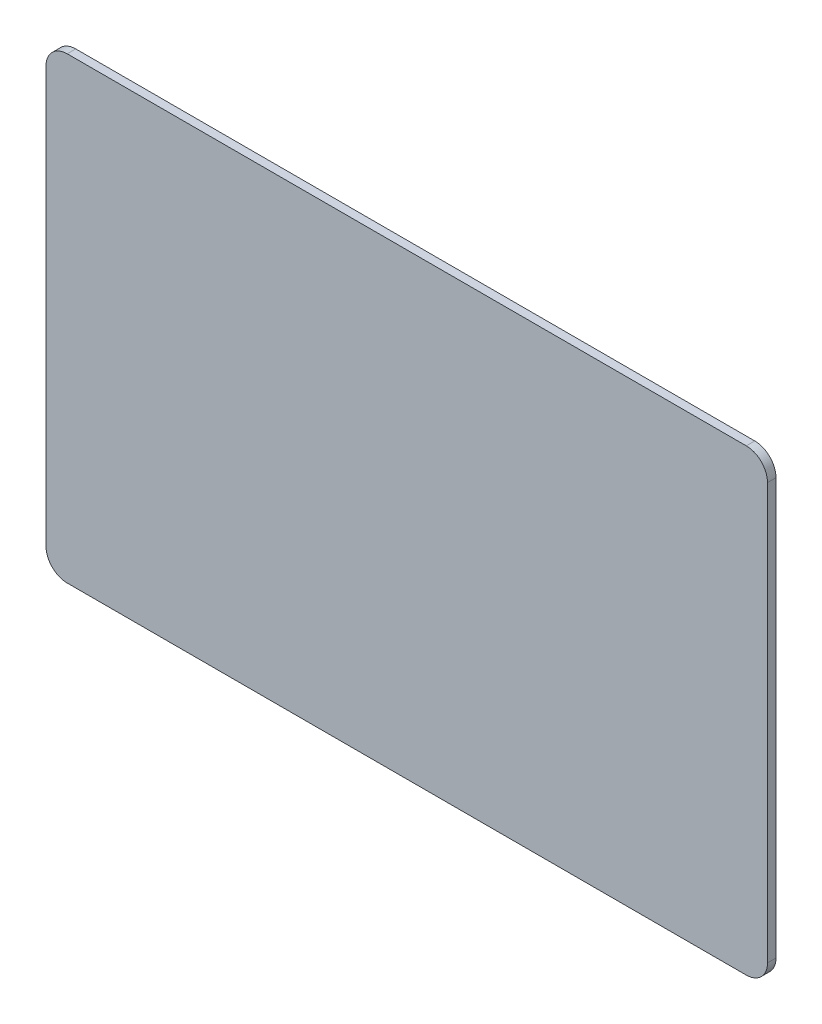
ISO-10303-21;
HEADER;
FILE_DESCRIPTION(('STEP AP214'),'2;1');
FILE_NAME('part.step','',(''),(''),'','','');
FILE_SCHEMA(('AUTOMOTIVE_DESIGN { 1 0 10303 214 1 1 1 1 }'));
ENDSEC;
DATA;
#1=APPLICATION_CONTEXT('core data for automotive mechanical design processes');
#2=APPLICATION_PROTOCOL_DEFINITION('international standard','automotive_design',2000,#1);
#3=PRODUCT_CONTEXT('',#1,'mechanical');
#4=PRODUCT('Part','Part','',(#3));
#5=PRODUCT_RELATED_PRODUCT_CATEGORY('part','',(#4));
#6=PRODUCT_DEFINITION_FORMATION('','',#4);
#7=PRODUCT_DEFINITION_CONTEXT('part definition',#1,'design');
#8=PRODUCT_DEFINITION('design','',#6,#7);
#9=PRODUCT_DEFINITION_SHAPE('','',#8);
#10=(LENGTH_UNIT() NAMED_UNIT(*) SI_UNIT(.MILLI.,.METRE.));
#11=(NAMED_UNIT(*) PLANE_ANGLE_UNIT() SI_UNIT($,.RADIAN.));
#12=(NAMED_UNIT(*) SI_UNIT($,.STERADIAN.) SOLID_ANGLE_UNIT());
#13=UNCERTAINTY_MEASURE_WITH_UNIT(LENGTH_MEASURE(1.E-05),#10,'distance_accuracy_value','');
#14=(GEOMETRIC_REPRESENTATION_CONTEXT(3) GLOBAL_UNCERTAINTY_ASSIGNED_CONTEXT((#13)) GLOBAL_UNIT_ASSIGNED_CONTEXT((#10,
#11,#12)) REPRESENTATION_CONTEXT('',''));
#15=CARTESIAN_POINT('',(0.,0.,0.));
#16=DIRECTION('',(0.,0.,1.));
#17=DIRECTION('',(1.,0.,0.));
#18=AXIS2_PLACEMENT_3D('',#15,#16,#17);
#19=CARTESIAN_POINT('',(2.5,2.5,1.));
#20=DIRECTION('',(0.,0.,-1.));
#21=DIRECTION('',(-1.,0.,0.));
#22=AXIS2_PLACEMENT_3D('',#19,#20,#21);
#23=CYLINDRICAL_SURFACE('',#22,2.5);
#24=CARTESIAN_POINT('',(2.5,2.5,0.));
#25=DIRECTION('',(0.,0.,1.));
#26=DIRECTION('',(-1.,0.,0.));
#27=AXIS2_PLACEMENT_3D('',#24,#25,#26);
#28=CIRCLE('',#27,2.5);
#29=CARTESIAN_POINT('',(0.,2.50000000000002,0.));
#30=VERTEX_POINT('',#29);
#31=CARTESIAN_POINT('',(2.50000000000002,0.,0.));
#32=VERTEX_POINT('',#31);
#33=EDGE_CURVE('E135',#30,#32,#28,.T.);
#34=ORIENTED_EDGE('',*,*,#33,.T.);
#35=DIRECTION('',(0.,0.,-1.));
#36=VECTOR('',#35,1.);
#37=CARTESIAN_POINT('',(2.50000000000002,0.,1.));
#38=LINE('',#37,#36);
#39=CARTESIAN_POINT('',(2.50000000000002,0.,1.));
#40=VERTEX_POINT('',#39);
#41=EDGE_CURVE('E11',#40,#32,#38,.T.);
#42=ORIENTED_EDGE('',*,*,#41,.F.);
#43=CARTESIAN_POINT('',(2.5,2.5,1.));
#44=DIRECTION('',(0.,0.,1.));
#45=DIRECTION('',(-1.,0.,0.));
#46=AXIS2_PLACEMENT_3D('',#43,#44,#45);
#47=CIRCLE('',#46,2.5);
#48=CARTESIAN_POINT('',(0.,2.50000000000002,1.));
#49=VERTEX_POINT('',#48);
#50=EDGE_CURVE('E149',#49,#40,#47,.T.);
#51=ORIENTED_EDGE('',*,*,#50,.F.);
#52=DIRECTION('',(0.,0.,-1.));
#53=VECTOR('',#52,1.);
#54=CARTESIAN_POINT('',(0.,2.50000000000002,1.));
#55=LINE('',#54,#53);
#56=EDGE_CURVE('E131',#49,#30,#55,.T.);
#57=ORIENTED_EDGE('',*,*,#56,.T.);
#58=EDGE_LOOP('',(#34,#42,#51,#57));
#59=FACE_BOUND('',#58,.T.);
#60=ADVANCED_FACE('F39',(#59),#23,.T.);
#61=CARTESIAN_POINT('',(2.50000000000002,0.,1.));
#62=DIRECTION('',(0.,1.,0.));
#63=DIRECTION('',(0.,0.,1.));
#64=AXIS2_PLACEMENT_3D('',#61,#62,#63);
#65=PLANE('',#64);
#66=DIRECTION('',(1.,0.,0.));
#67=VECTOR('',#66,1.);
#68=CARTESIAN_POINT('',(2.50000000000002,0.,0.));
#69=LINE('',#68,#67);
#70=CARTESIAN_POINT('',(82.5,0.,0.));
#71=VERTEX_POINT('',#70);
#72=EDGE_CURVE('E138',#32,#71,#69,.T.);
#73=ORIENTED_EDGE('',*,*,#72,.T.);
#74=DIRECTION('',(0.,0.,-1.));
#75=VECTOR('',#74,1.);
#76=CARTESIAN_POINT('',(82.5,0.,1.));
#77=LINE('',#76,#75);
#78=CARTESIAN_POINT('',(82.5,0.,1.));
#79=VERTEX_POINT('',#78);
#80=EDGE_CURVE('E47',#79,#71,#77,.T.);
#81=ORIENTED_EDGE('',*,*,#80,.F.);
#82=DIRECTION('',(1.,0.,0.));
#83=VECTOR('',#82,1.);
#84=CARTESIAN_POINT('',(2.50000000000002,0.,1.));
#85=LINE('',#84,#83);
#86=EDGE_CURVE('E98',#40,#79,#85,.T.);
#87=ORIENTED_EDGE('',*,*,#86,.F.);
#88=ORIENTED_EDGE('',*,*,#41,.T.);
#89=EDGE_LOOP('',(#73,#81,#87,#88));
#90=FACE_BOUND('',#89,.T.);
#91=ADVANCED_FACE('F184',(#90),#65,.F.);
#92=CARTESIAN_POINT('',(82.5,2.5,1.));
#93=DIRECTION('',(0.,0.,-1.));
#94=DIRECTION('',(-1.,0.,0.));
#95=AXIS2_PLACEMENT_3D('',#92,#93,#94);
#96=CYLINDRICAL_SURFACE('',#95,2.5);
#97=CARTESIAN_POINT('',(82.5,2.5,0.));
#98=DIRECTION('',(0.,0.,1.));
#99=DIRECTION('',(1.,0.,0.));
#100=AXIS2_PLACEMENT_3D('',#97,#98,#99);
#101=CIRCLE('',#100,2.5);
#102=CARTESIAN_POINT('',(85.,2.5,0.));
#103=VERTEX_POINT('',#102);
#104=EDGE_CURVE('E140',#71,#103,#101,.T.);
#105=ORIENTED_EDGE('',*,*,#104,.T.);
#106=DIRECTION('',(0.,0.,-1.));
#107=VECTOR('',#106,1.);
#108=CARTESIAN_POINT('',(85.,2.5,1.));
#109=LINE('',#108,#107);
#110=CARTESIAN_POINT('',(85.,2.5,1.));
#111=VERTEX_POINT('',#110);
#112=EDGE_CURVE('E156',#111,#103,#109,.T.);
#113=ORIENTED_EDGE('',*,*,#112,.F.);
#114=CARTESIAN_POINT('',(82.5,2.5,1.));
#115=DIRECTION('',(0.,0.,1.));
#116=DIRECTION('',(1.,0.,0.));
#117=AXIS2_PLACEMENT_3D('',#114,#115,#116);
#118=CIRCLE('',#117,2.5);
#119=EDGE_CURVE('E164',#79,#111,#118,.T.);
#120=ORIENTED_EDGE('',*,*,#119,.F.);
#121=ORIENTED_EDGE('',*,*,#80,.T.);
#122=EDGE_LOOP('',(#105,#113,#120,#121));
#123=FACE_BOUND('',#122,.T.);
#124=ADVANCED_FACE('F162',(#123),#96,.T.);
#125=CARTESIAN_POINT('',(85.,2.50000000000002,1.));
#126=DIRECTION('',(-1.,0.,0.));
#127=DIRECTION('',(0.,0.,1.));
#128=AXIS2_PLACEMENT_3D('',#125,#126,#127);
#129=PLANE('',#128);
#130=DIRECTION('',(0.,1.,0.));
#131=VECTOR('',#130,1.);
#132=CARTESIAN_POINT('',(85.,2.50000000000002,0.));
#133=LINE('',#132,#131);
#134=CARTESIAN_POINT('',(85.,51.5,0.));
#135=VERTEX_POINT('',#134);
#136=EDGE_CURVE('E142',#103,#135,#133,.T.);
#137=ORIENTED_EDGE('',*,*,#136,.T.);
#138=DIRECTION('',(0.,0.,-1.));
#139=VECTOR('',#138,1.);
#140=CARTESIAN_POINT('',(85.,51.5,1.));
#141=LINE('',#140,#139);
#142=CARTESIAN_POINT('',(85.,51.5,1.));
#143=VERTEX_POINT('',#142);
#144=EDGE_CURVE('E153',#143,#135,#141,.T.);
#145=ORIENTED_EDGE('',*,*,#144,.F.);
#146=DIRECTION('',(0.,1.,0.));
#147=VECTOR('',#146,1.);
#148=CARTESIAN_POINT('',(85.,2.50000000000002,1.));
#149=LINE('',#148,#147);
#150=EDGE_CURVE('E176',#111,#143,#149,.T.);
#151=ORIENTED_EDGE('',*,*,#150,.F.);
#152=ORIENTED_EDGE('',*,*,#112,.T.);
#153=EDGE_LOOP('',(#137,#145,#151,#152));
#154=FACE_BOUND('',#153,.T.);
#155=ADVANCED_FACE('F172',(#154),#129,.F.);
#156=CARTESIAN_POINT('',(82.5,51.5,1.));
#157=DIRECTION('',(0.,0.,-1.));
#158=DIRECTION('',(-1.,0.,0.));
#159=AXIS2_PLACEMENT_3D('',#156,#157,#158);
#160=CYLINDRICAL_SURFACE('',#159,2.5);
#161=CARTESIAN_POINT('',(82.5,51.5,0.));
#162=DIRECTION('',(0.,0.,1.));
#163=DIRECTION('',(-1.,0.,0.));
#164=AXIS2_PLACEMENT_3D('',#161,#162,#163);
#165=CIRCLE('',#164,2.5);
#166=CARTESIAN_POINT('',(82.5,54.,0.));
#167=VERTEX_POINT('',#166);
#168=EDGE_CURVE('E144',#135,#167,#165,.T.);
#169=ORIENTED_EDGE('',*,*,#168,.T.);
#170=DIRECTION('',(0.,0.,-1.));
#171=VECTOR('',#170,1.);
#172=CARTESIAN_POINT('',(82.5,54.,1.));
#173=LINE('',#172,#171);
#174=CARTESIAN_POINT('',(82.5,54.,1.));
#175=VERTEX_POINT('',#174);
#176=EDGE_CURVE('E126',#175,#167,#173,.T.);
#177=ORIENTED_EDGE('',*,*,#176,.F.);
#178=CARTESIAN_POINT('',(82.5,51.5,1.));
#179=DIRECTION('',(0.,0.,1.));
#180=DIRECTION('',(-1.,0.,0.));
#181=AXIS2_PLACEMENT_3D('',#178,#179,#180);
#182=CIRCLE('',#181,2.5);
#183=EDGE_CURVE('E117',#143,#175,#182,.T.);
#184=ORIENTED_EDGE('',*,*,#183,.F.);
#185=ORIENTED_EDGE('',*,*,#144,.T.);
#186=EDGE_LOOP('',(#169,#177,#184,#185));
#187=FACE_BOUND('',#186,.T.);
#188=ADVANCED_FACE('F175',(#187),#160,.T.);
#189=CARTESIAN_POINT('',(2.50000000000002,54.,1.));
#190=DIRECTION('',(0.,-1.,0.));
#191=DIRECTION('',(0.,0.,-1.));
#192=AXIS2_PLACEMENT_3D('',#189,#190,#191);
#193=PLANE('',#192);
#194=DIRECTION('',(-1.,0.,0.));
#195=VECTOR('',#194,1.);
#196=CARTESIAN_POINT('',(2.50000000000002,54.,0.));
#197=LINE('',#196,#195);
#198=CARTESIAN_POINT('',(2.50000000000002,54.,0.));
#199=VERTEX_POINT('',#198);
#200=EDGE_CURVE('E125',#167,#199,#197,.T.);
#201=ORIENTED_EDGE('',*,*,#200,.T.);
#202=DIRECTION('',(0.,0.,-1.));
#203=VECTOR('',#202,1.);
#204=CARTESIAN_POINT('',(2.50000000000002,54.,1.));
#205=LINE('',#204,#203);
#206=CARTESIAN_POINT('',(2.50000000000002,54.,1.));
#207=VERTEX_POINT('',#206);
#208=EDGE_CURVE('E122',#207,#199,#205,.T.);
#209=ORIENTED_EDGE('',*,*,#208,.F.);
#210=DIRECTION('',(-1.,0.,0.));
#211=VECTOR('',#210,1.);
#212=CARTESIAN_POINT('',(2.50000000000002,54.,1.));
#213=LINE('',#212,#211);
#214=EDGE_CURVE('E111',#175,#207,#213,.T.);
#215=ORIENTED_EDGE('',*,*,#214,.F.);
#216=ORIENTED_EDGE('',*,*,#176,.T.);
#217=EDGE_LOOP('',(#201,#209,#215,#216));
#218=FACE_BOUND('',#217,.T.);
#219=ADVANCED_FACE('F123',(#218),#193,.F.);
#220=CARTESIAN_POINT('',(2.5,51.5,1.));
#221=DIRECTION('',(0.,0.,-1.));
#222=DIRECTION('',(-1.,0.,0.));
#223=AXIS2_PLACEMENT_3D('',#220,#221,#222);
#224=CYLINDRICAL_SURFACE('',#223,2.5);
#225=CARTESIAN_POINT('',(2.5,51.5,0.));
#226=DIRECTION('',(0.,0.,1.));
#227=DIRECTION('',(-1.,0.,0.));
#228=AXIS2_PLACEMENT_3D('',#225,#226,#227);
#229=CIRCLE('',#228,2.5);
#230=CARTESIAN_POINT('',(0.,51.5,0.));
#231=VERTEX_POINT('',#230);
#232=EDGE_CURVE('E84',#199,#231,#229,.T.);
#233=ORIENTED_EDGE('',*,*,#232,.T.);
#234=DIRECTION('',(0.,0.,-1.));
#235=VECTOR('',#234,1.);
#236=CARTESIAN_POINT('',(0.,51.5,1.));
#237=LINE('',#236,#235);
#238=CARTESIAN_POINT('',(0.,51.5,1.));
#239=VERTEX_POINT('',#238);
#240=EDGE_CURVE('E127',#239,#231,#237,.T.);
#241=ORIENTED_EDGE('',*,*,#240,.F.);
#242=CARTESIAN_POINT('',(2.5,51.5,1.));
#243=DIRECTION('',(0.,0.,1.));
#244=DIRECTION('',(-1.,0.,0.));
#245=AXIS2_PLACEMENT_3D('',#242,#243,#244);
#246=CIRCLE('',#245,2.5);
#247=EDGE_CURVE('E115',#207,#239,#246,.T.);
#248=ORIENTED_EDGE('',*,*,#247,.F.);
#249=ORIENTED_EDGE('',*,*,#208,.T.);
#250=EDGE_LOOP('',(#233,#241,#248,#249));
#251=FACE_BOUND('',#250,.T.);
#252=ADVANCED_FACE('F129',(#251),#224,.T.);
#253=CARTESIAN_POINT('',(0.,2.50000000000002,1.));
#254=DIRECTION('',(1.,0.,0.));
#255=DIRECTION('',(0.,0.,-1.));
#256=AXIS2_PLACEMENT_3D('',#253,#254,#255);
#257=PLANE('',#256);
#258=DIRECTION('',(0.,-1.,0.));
#259=VECTOR('',#258,1.);
#260=CARTESIAN_POINT('',(0.,2.50000000000002,0.));
#261=LINE('',#260,#259);
#262=EDGE_CURVE('E90',#231,#30,#261,.T.);
#263=ORIENTED_EDGE('',*,*,#262,.T.);
#264=ORIENTED_EDGE('',*,*,#56,.F.);
#265=DIRECTION('',(0.,-1.,0.));
#266=VECTOR('',#265,1.);
#267=CARTESIAN_POINT('',(0.,2.50000000000002,1.));
#268=LINE('',#267,#266);
#269=EDGE_CURVE('E55',#239,#49,#268,.T.);
#270=ORIENTED_EDGE('',*,*,#269,.F.);
#271=ORIENTED_EDGE('',*,*,#240,.T.);
#272=EDGE_LOOP('',(#263,#264,#270,#271));
#273=FACE_BOUND('',#272,.T.);
#274=ADVANCED_FACE('F200',(#273),#257,.F.);
#275=CARTESIAN_POINT('',(2.5,2.5,1.));
#276=DIRECTION('',(0.,0.,-1.));
#277=DIRECTION('',(-1.,0.,0.));
#278=AXIS2_PLACEMENT_3D('',#275,#276,#277);
#279=PLANE('',#278);
#280=ORIENTED_EDGE('',*,*,#50,.T.);
#281=ORIENTED_EDGE('',*,*,#86,.T.);
#282=ORIENTED_EDGE('',*,*,#119,.T.);
#283=ORIENTED_EDGE('',*,*,#150,.T.);
#284=ORIENTED_EDGE('',*,*,#183,.T.);
#285=ORIENTED_EDGE('',*,*,#214,.T.);
#286=ORIENTED_EDGE('',*,*,#247,.T.);
#287=ORIENTED_EDGE('',*,*,#269,.T.);
#288=EDGE_LOOP('',(#280,#281,#282,#283,#284,#285,#286,#287));
#289=FACE_BOUND('',#288,.T.);
#290=ADVANCED_FACE('F113',(#289),#279,.F.);
#291=CARTESIAN_POINT('',(2.5,2.5,0.));
#292=DIRECTION('',(0.,0.,-1.));
#293=DIRECTION('',(-1.,0.,0.));
#294=AXIS2_PLACEMENT_3D('',#291,#292,#293);
#295=PLANE('',#294);
#296=ORIENTED_EDGE('',*,*,#33,.F.);
#297=ORIENTED_EDGE('',*,*,#262,.F.);
#298=ORIENTED_EDGE('',*,*,#232,.F.);
#299=ORIENTED_EDGE('',*,*,#200,.F.);
#300=ORIENTED_EDGE('',*,*,#168,.F.);
#301=ORIENTED_EDGE('',*,*,#136,.F.);
#302=ORIENTED_EDGE('',*,*,#104,.F.);
#303=ORIENTED_EDGE('',*,*,#72,.F.);
#304=EDGE_LOOP('',(#296,#297,#298,#299,#300,#301,#302,#303));
#305=FACE_BOUND('',#304,.T.);
#306=ADVANCED_FACE('F168',(#305),#295,.T.);
#307=CLOSED_SHELL('',(#60,#91,#124,#155,#188,#219,#252,#274,#290,#306));
#308=MANIFOLD_SOLID_BREP('B2',#307);
#309=ADVANCED_BREP_SHAPE_REPRESENTATION('',(#18,#308),#14);
#310=SHAPE_DEFINITION_REPRESENTATION(#9,#309);
ENDSEC;
END-ISO-10303-21;
